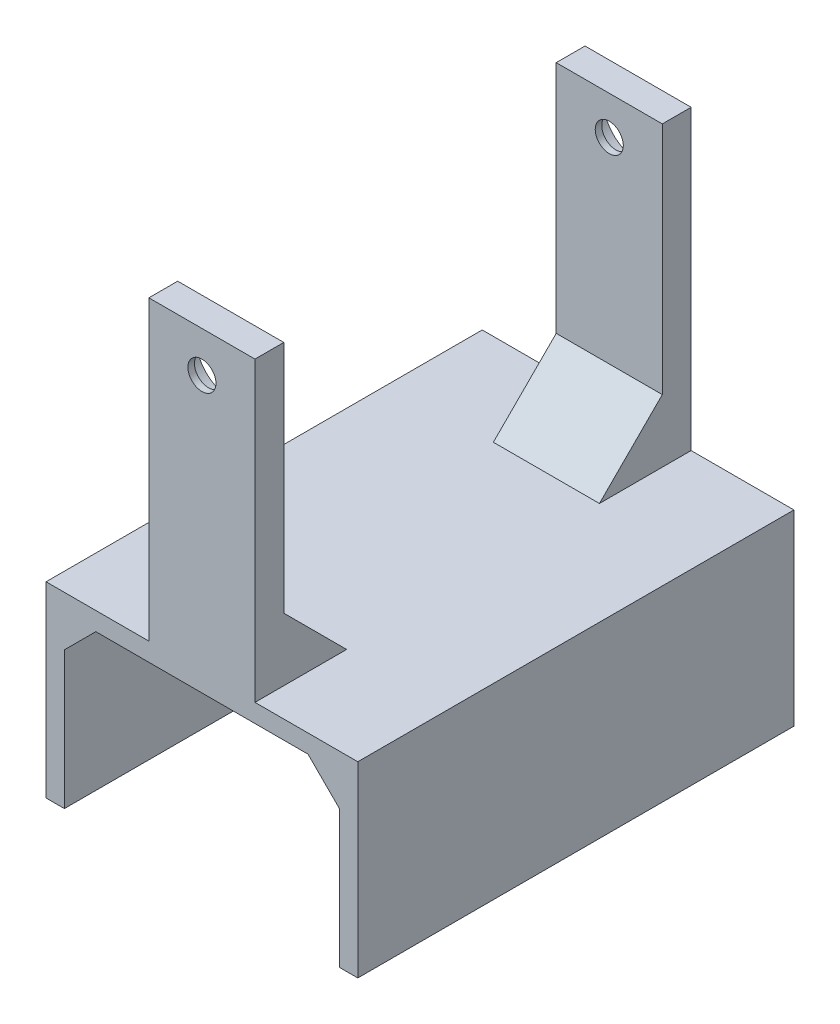
ISO-10303-21;
HEADER;
FILE_DESCRIPTION(('STEP AP214'),'2;1');
FILE_NAME('part.step','',(''),(''),'','','');
FILE_SCHEMA(('AUTOMOTIVE_DESIGN { 1 0 10303 214 1 1 1 1 }'));
ENDSEC;
DATA;
#1=APPLICATION_CONTEXT('core data for automotive mechanical design processes');
#2=APPLICATION_PROTOCOL_DEFINITION('international standard','automotive_design',2000,#1);
#3=PRODUCT_CONTEXT('',#1,'mechanical');
#4=PRODUCT('Part','Part','',(#3));
#5=PRODUCT_RELATED_PRODUCT_CATEGORY('part','',(#4));
#6=PRODUCT_DEFINITION_FORMATION('','',#4);
#7=PRODUCT_DEFINITION_CONTEXT('part definition',#1,'design');
#8=PRODUCT_DEFINITION('design','',#6,#7);
#9=PRODUCT_DEFINITION_SHAPE('','',#8);
#10=(LENGTH_UNIT() NAMED_UNIT(*) SI_UNIT(.MILLI.,.METRE.));
#11=(NAMED_UNIT(*) PLANE_ANGLE_UNIT() SI_UNIT($,.RADIAN.));
#12=(NAMED_UNIT(*) SI_UNIT($,.STERADIAN.) SOLID_ANGLE_UNIT());
#13=UNCERTAINTY_MEASURE_WITH_UNIT(LENGTH_MEASURE(1.E-05),#10,'distance_accuracy_value','');
#14=(GEOMETRIC_REPRESENTATION_CONTEXT(3) GLOBAL_UNCERTAINTY_ASSIGNED_CONTEXT((#13)) GLOBAL_UNIT_ASSIGNED_CONTEXT((#10,
#11,#12)) REPRESENTATION_CONTEXT('',''));
#15=CARTESIAN_POINT('',(0.,0.,0.));
#16=DIRECTION('',(0.,0.,1.));
#17=DIRECTION('',(1.,0.,0.));
#18=AXIS2_PLACEMENT_3D('',#15,#16,#17);
#19=CARTESIAN_POINT('',(0.,112.35,130.62));
#20=DIRECTION('',(0.,0.,1.));
#21=DIRECTION('',(1.,0.,0.));
#22=AXIS2_PLACEMENT_3D('',#19,#20,#21);
#23=CYLINDRICAL_SURFACE('',#22,4.5);
#24=CARTESIAN_POINT('',(0.,112.35,139.86));
#25=DIRECTION('',(0.,0.,1.));
#26=DIRECTION('',(1.,0.,0.));
#27=AXIS2_PLACEMENT_3D('',#24,#25,#26);
#28=CIRCLE('',#27,4.5);
#29=CARTESIAN_POINT('',(4.5,112.35,139.86));
#30=VERTEX_POINT('',#29);
#31=EDGE_CURVE('E238',#30,#30,#28,.T.);
#32=ORIENTED_EDGE('',*,*,#31,.T.);
#33=EDGE_LOOP('',(#32));
#34=FACE_BOUND('',#33,.T.);
#35=CARTESIAN_POINT('',(0.,112.35,137.76));
#36=DIRECTION('',(0.,0.,-1.));
#37=DIRECTION('',(-1.,0.,0.));
#38=AXIS2_PLACEMENT_3D('',#35,#36,#37);
#39=CIRCLE('',#38,4.5);
#40=CARTESIAN_POINT('',(-4.5,112.35,137.76));
#41=VERTEX_POINT('',#40);
#42=EDGE_CURVE('E38',#41,#41,#39,.F.);
#43=ORIENTED_EDGE('',*,*,#42,.F.);
#44=EDGE_LOOP('',(#43));
#45=FACE_BOUND('',#44,.T.);
#46=ADVANCED_FACE('F34',(#34,#45),#23,.F.);
#47=CARTESIAN_POINT('',(0.,30.03,139.86));
#48=DIRECTION('',(0.,-1.,0.));
#49=DIRECTION('',(1.,0.,0.));
#50=AXIS2_PLACEMENT_3D('',#47,#48,#49);
#51=PLANE('',#50);
#52=DIRECTION('',(1.,0.,0.));
#53=VECTOR('',#52,1.);
#54=CARTESIAN_POINT('',(-17.01,30.03,29.4));
#55=LINE('',#54,#53);
#56=CARTESIAN_POINT('',(-17.01,30.03,29.4));
#57=VERTEX_POINT('',#56);
#58=CARTESIAN_POINT('',(17.01,30.03,29.4));
#59=VERTEX_POINT('',#58);
#60=EDGE_CURVE('E195',#57,#59,#55,.T.);
#61=ORIENTED_EDGE('',*,*,#60,.F.);
#62=DIRECTION('',(0.,0.,-1.));
#63=VECTOR('',#62,1.);
#64=CARTESIAN_POINT('',(-17.01,30.03,9.24));
#65=LINE('',#64,#63);
#66=CARTESIAN_POINT('',(-17.01,30.03,0.));
#67=VERTEX_POINT('',#66);
#68=EDGE_CURVE('E51',#57,#67,#65,.T.);
#69=ORIENTED_EDGE('',*,*,#68,.T.);
#70=DIRECTION('',(-1.,0.,0.));
#71=VECTOR('',#70,1.);
#72=CARTESIAN_POINT('',(0.,30.03,0.));
#73=LINE('',#72,#71);
#74=CARTESIAN_POINT('',(-49.98,30.03,0.));
#75=VERTEX_POINT('',#74);
#76=EDGE_CURVE('E322',#67,#75,#73,.T.);
#77=ORIENTED_EDGE('',*,*,#76,.T.);
#78=DIRECTION('',(0.,0.,-1.));
#79=VECTOR('',#78,1.);
#80=CARTESIAN_POINT('',(-49.98,30.03,139.86));
#81=LINE('',#80,#79);
#82=CARTESIAN_POINT('',(-49.98,30.03,139.86));
#83=VERTEX_POINT('',#82);
#84=EDGE_CURVE('E333',#83,#75,#81,.T.);
#85=ORIENTED_EDGE('',*,*,#84,.F.);
#86=DIRECTION('',(-1.,0.,0.));
#87=VECTOR('',#86,1.);
#88=CARTESIAN_POINT('',(0.,30.03,139.86));
#89=LINE('',#88,#87);
#90=CARTESIAN_POINT('',(-17.01,30.03,139.86));
#91=VERTEX_POINT('',#90);
#92=EDGE_CURVE('E303',#91,#83,#89,.T.);
#93=ORIENTED_EDGE('',*,*,#92,.F.);
#94=DIRECTION('',(0.,0.,1.));
#95=VECTOR('',#94,1.);
#96=CARTESIAN_POINT('',(-17.01,30.03,130.62));
#97=LINE('',#96,#95);
#98=CARTESIAN_POINT('',(-17.01,30.03,110.46));
#99=VERTEX_POINT('',#98);
#100=EDGE_CURVE('E253',#99,#91,#97,.T.);
#101=ORIENTED_EDGE('',*,*,#100,.F.);
#102=DIRECTION('',(1.,0.,0.));
#103=VECTOR('',#102,1.);
#104=CARTESIAN_POINT('',(-17.01,30.03,110.46));
#105=LINE('',#104,#103);
#106=CARTESIAN_POINT('',(17.01,30.03,110.46));
#107=VERTEX_POINT('',#106);
#108=EDGE_CURVE('E235',#99,#107,#105,.T.);
#109=ORIENTED_EDGE('',*,*,#108,.T.);
#110=DIRECTION('',(0.,0.,1.));
#111=VECTOR('',#110,1.);
#112=CARTESIAN_POINT('',(17.01,30.03,130.62));
#113=LINE('',#112,#111);
#114=CARTESIAN_POINT('',(17.01,30.03,139.86));
#115=VERTEX_POINT('',#114);
#116=EDGE_CURVE('E266',#107,#115,#113,.T.);
#117=ORIENTED_EDGE('',*,*,#116,.T.);
#118=CARTESIAN_POINT('',(49.98,30.03,139.86));
#119=VERTEX_POINT('',#118);
#120=EDGE_CURVE('E304',#119,#115,#89,.T.);
#121=ORIENTED_EDGE('',*,*,#120,.F.);
#122=DIRECTION('',(0.,0.,-1.));
#123=VECTOR('',#122,1.);
#124=CARTESIAN_POINT('',(49.98,30.03,139.86));
#125=LINE('',#124,#123);
#126=CARTESIAN_POINT('',(49.98,30.03,0.));
#127=VERTEX_POINT('',#126);
#128=EDGE_CURVE('E336',#119,#127,#125,.T.);
#129=ORIENTED_EDGE('',*,*,#128,.T.);
#130=CARTESIAN_POINT('',(17.01,30.03,0.));
#131=VERTEX_POINT('',#130);
#132=EDGE_CURVE('E323',#127,#131,#73,.T.);
#133=ORIENTED_EDGE('',*,*,#132,.T.);
#134=DIRECTION('',(0.,0.,-1.));
#135=VECTOR('',#134,1.);
#136=CARTESIAN_POINT('',(17.01,30.03,9.24));
#137=LINE('',#136,#135);
#138=EDGE_CURVE('E58',#59,#131,#137,.T.);
#139=ORIENTED_EDGE('',*,*,#138,.F.);
#140=EDGE_LOOP('',(#61,#69,#77,#85,#93,#101,#109,#117,#121,#129,#133,#139));
#141=FACE_BOUND('',#140,.T.);
#142=ADVANCED_FACE('F346',(#141),#51,.F.);
#143=CARTESIAN_POINT('',(0.,113.108647765644,9.24));
#144=DIRECTION('',(0.,0.,-1.));
#145=DIRECTION('',(-1.,0.,0.));
#146=AXIS2_PLACEMENT_3D('',#143,#144,#145);
#147=CYLINDRICAL_SURFACE('',#146,4.5);
#148=CARTESIAN_POINT('',(0.,113.108647765644,9.24));
#149=DIRECTION('',(0.,0.,-1.));
#150=DIRECTION('',(-1.,0.,0.));
#151=AXIS2_PLACEMENT_3D('',#148,#149,#150);
#152=CIRCLE('',#151,4.5);
#153=CARTESIAN_POINT('',(-4.5,113.108647765644,9.24));
#154=VERTEX_POINT('',#153);
#155=EDGE_CURVE('E213',#154,#154,#152,.T.);
#156=ORIENTED_EDGE('',*,*,#155,.F.);
#157=EDGE_LOOP('',(#156));
#158=FACE_BOUND('',#157,.T.);
#159=CARTESIAN_POINT('',(0.,113.108647765644,7.14));
#160=DIRECTION('',(0.,0.,-1.));
#161=DIRECTION('',(-1.,0.,0.));
#162=AXIS2_PLACEMENT_3D('',#159,#160,#161);
#163=CIRCLE('',#162,4.5);
#164=CARTESIAN_POINT('',(-4.5,113.108647765644,7.14));
#165=VERTEX_POINT('',#164);
#166=EDGE_CURVE('E210',#165,#165,#163,.F.);
#167=ORIENTED_EDGE('',*,*,#166,.F.);
#168=EDGE_LOOP('',(#167));
#169=FACE_BOUND('',#168,.T.);
#170=ADVANCED_FACE('F344',(#158,#169),#147,.F.);
#171=CARTESIAN_POINT('',(0.,24.15,139.86));
#172=DIRECTION('',(0.,1.,0.));
#173=DIRECTION('',(0.,0.,1.));
#174=AXIS2_PLACEMENT_3D('',#171,#172,#173);
#175=PLANE('',#174);
#176=DIRECTION('',(1.,0.,0.));
#177=VECTOR('',#176,1.);
#178=CARTESIAN_POINT('',(0.,24.15,0.));
#179=LINE('',#178,#177);
#180=CARTESIAN_POINT('',(-34.02,24.15,0.));
#181=VERTEX_POINT('',#180);
#182=CARTESIAN_POINT('',(34.02,24.15,0.));
#183=VERTEX_POINT('',#182);
#184=EDGE_CURVE('E288',#181,#183,#179,.T.);
#185=ORIENTED_EDGE('',*,*,#184,.T.);
#186=DIRECTION('',(0.,0.,1.));
#187=VECTOR('',#186,1.);
#188=CARTESIAN_POINT('',(34.02,24.15,0.));
#189=LINE('',#188,#187);
#190=CARTESIAN_POINT('',(34.02,24.15,139.86));
#191=VERTEX_POINT('',#190);
#192=EDGE_CURVE('E273',#183,#191,#189,.T.);
#193=ORIENTED_EDGE('',*,*,#192,.T.);
#194=DIRECTION('',(1.,0.,0.));
#195=VECTOR('',#194,1.);
#196=CARTESIAN_POINT('',(0.,24.15,139.86));
#197=LINE('',#196,#195);
#198=CARTESIAN_POINT('',(-34.02,24.15,139.86));
#199=VERTEX_POINT('',#198);
#200=EDGE_CURVE('E291',#199,#191,#197,.T.);
#201=ORIENTED_EDGE('',*,*,#200,.F.);
#202=DIRECTION('',(0.,0.,1.));
#203=VECTOR('',#202,1.);
#204=CARTESIAN_POINT('',(-34.02,24.15,0.));
#205=LINE('',#204,#203);
#206=EDGE_CURVE('E286',#181,#199,#205,.T.);
#207=ORIENTED_EDGE('',*,*,#206,.F.);
#208=EDGE_LOOP('',(#185,#193,#201,#207));
#209=FACE_BOUND('',#208,.T.);
#210=ADVANCED_FACE('F36',(#209),#175,.F.);
#211=CARTESIAN_POINT('',(44.1,0.,139.86));
#212=DIRECTION('',(1.,0.,0.));
#213=DIRECTION('',(0.,1.,0.));
#214=AXIS2_PLACEMENT_3D('',#211,#212,#213);
#215=PLANE('',#214);
#216=DIRECTION('',(0.,-1.,0.));
#217=VECTOR('',#216,1.);
#218=CARTESIAN_POINT('',(44.1,0.,139.86));
#219=LINE('',#218,#217);
#220=CARTESIAN_POINT('',(44.1,14.07,139.86));
#221=VERTEX_POINT('',#220);
#222=CARTESIAN_POINT('',(44.1,-30.03,139.86));
#223=VERTEX_POINT('',#222);
#224=EDGE_CURVE('E294',#221,#223,#219,.T.);
#225=ORIENTED_EDGE('',*,*,#224,.F.);
#226=DIRECTION('',(0.,0.,1.));
#227=VECTOR('',#226,1.);
#228=CARTESIAN_POINT('',(44.1,14.07,0.));
#229=LINE('',#228,#227);
#230=CARTESIAN_POINT('',(44.1,14.07,0.));
#231=VERTEX_POINT('',#230);
#232=EDGE_CURVE('E276',#231,#221,#229,.T.);
#233=ORIENTED_EDGE('',*,*,#232,.F.);
#234=DIRECTION('',(0.,-1.,0.));
#235=VECTOR('',#234,1.);
#236=CARTESIAN_POINT('',(44.1,0.,0.));
#237=LINE('',#236,#235);
#238=CARTESIAN_POINT('',(44.1,-30.03,0.));
#239=VERTEX_POINT('',#238);
#240=EDGE_CURVE('E314',#231,#239,#237,.T.);
#241=ORIENTED_EDGE('',*,*,#240,.T.);
#242=DIRECTION('',(0.,0.,-1.));
#243=VECTOR('',#242,1.);
#244=CARTESIAN_POINT('',(44.1,-30.03,139.86));
#245=LINE('',#244,#243);
#246=EDGE_CURVE('E11',#223,#239,#245,.T.);
#247=ORIENTED_EDGE('',*,*,#246,.F.);
#248=EDGE_LOOP('',(#225,#233,#241,#247));
#249=FACE_BOUND('',#248,.T.);
#250=ADVANCED_FACE('F353',(#249),#215,.F.);
#251=CARTESIAN_POINT('',(0.,-30.03,139.86));
#252=DIRECTION('',(0.,-1.,0.));
#253=DIRECTION('',(1.,0.,0.));
#254=AXIS2_PLACEMENT_3D('',#251,#252,#253);
#255=PLANE('',#254);
#256=DIRECTION('',(-1.,0.,0.));
#257=VECTOR('',#256,1.);
#258=CARTESIAN_POINT('',(0.,-30.03,0.));
#259=LINE('',#258,#257);
#260=CARTESIAN_POINT('',(49.98,-30.03,0.));
#261=VERTEX_POINT('',#260);
#262=EDGE_CURVE('E316',#261,#239,#259,.T.);
#263=ORIENTED_EDGE('',*,*,#262,.F.);
#264=DIRECTION('',(0.,0.,-1.));
#265=VECTOR('',#264,1.);
#266=CARTESIAN_POINT('',(49.98,-30.03,139.86));
#267=LINE('',#266,#265);
#268=CARTESIAN_POINT('',(49.98,-30.03,139.86));
#269=VERTEX_POINT('',#268);
#270=EDGE_CURVE('E43',#269,#261,#267,.T.);
#271=ORIENTED_EDGE('',*,*,#270,.F.);
#272=DIRECTION('',(-1.,0.,0.));
#273=VECTOR('',#272,1.);
#274=CARTESIAN_POINT('',(0.,-30.03,139.86));
#275=LINE('',#274,#273);
#276=EDGE_CURVE('E297',#269,#223,#275,.T.);
#277=ORIENTED_EDGE('',*,*,#276,.T.);
#278=ORIENTED_EDGE('',*,*,#246,.T.);
#279=EDGE_LOOP('',(#263,#271,#277,#278));
#280=FACE_BOUND('',#279,.T.);
#281=ADVANCED_FACE('F410',(#280),#255,.T.);
#282=CARTESIAN_POINT('',(49.98,0.,139.86));
#283=DIRECTION('',(-1.,0.,0.));
#284=DIRECTION('',(0.,0.,1.));
#285=AXIS2_PLACEMENT_3D('',#282,#283,#284);
#286=PLANE('',#285);
#287=DIRECTION('',(0.,1.,0.));
#288=VECTOR('',#287,1.);
#289=CARTESIAN_POINT('',(49.98,0.,0.));
#290=LINE('',#289,#288);
#291=EDGE_CURVE('E319',#261,#127,#290,.T.);
#292=ORIENTED_EDGE('',*,*,#291,.T.);
#293=ORIENTED_EDGE('',*,*,#128,.F.);
#294=DIRECTION('',(0.,1.,0.));
#295=VECTOR('',#294,1.);
#296=CARTESIAN_POINT('',(49.98,0.,139.86));
#297=LINE('',#296,#295);
#298=EDGE_CURVE('E300',#269,#119,#297,.T.);
#299=ORIENTED_EDGE('',*,*,#298,.F.);
#300=ORIENTED_EDGE('',*,*,#270,.T.);
#301=EDGE_LOOP('',(#292,#293,#299,#300));
#302=FACE_BOUND('',#301,.T.);
#303=ADVANCED_FACE('F412',(#302),#286,.F.);
#304=CARTESIAN_POINT('',(-49.98,0.,139.86));
#305=DIRECTION('',(-1.,0.,0.));
#306=DIRECTION('',(0.,0.,1.));
#307=AXIS2_PLACEMENT_3D('',#304,#305,#306);
#308=PLANE('',#307);
#309=DIRECTION('',(0.,1.,0.));
#310=VECTOR('',#309,1.);
#311=CARTESIAN_POINT('',(-49.98,0.,0.));
#312=LINE('',#311,#310);
#313=CARTESIAN_POINT('',(-49.98,-30.03,0.));
#314=VERTEX_POINT('',#313);
#315=EDGE_CURVE('E325',#314,#75,#312,.T.);
#316=ORIENTED_EDGE('',*,*,#315,.F.);
#317=DIRECTION('',(0.,0.,-1.));
#318=VECTOR('',#317,1.);
#319=CARTESIAN_POINT('',(-49.98,-30.03,139.86));
#320=LINE('',#319,#318);
#321=CARTESIAN_POINT('',(-49.98,-30.03,139.86));
#322=VERTEX_POINT('',#321);
#323=EDGE_CURVE('E331',#322,#314,#320,.T.);
#324=ORIENTED_EDGE('',*,*,#323,.F.);
#325=DIRECTION('',(0.,1.,0.));
#326=VECTOR('',#325,1.);
#327=CARTESIAN_POINT('',(-49.98,0.,139.86));
#328=LINE('',#327,#326);
#329=EDGE_CURVE('E307',#322,#83,#328,.T.);
#330=ORIENTED_EDGE('',*,*,#329,.T.);
#331=ORIENTED_EDGE('',*,*,#84,.T.);
#332=EDGE_LOOP('',(#316,#324,#330,#331));
#333=FACE_BOUND('',#332,.T.);
#334=ADVANCED_FACE('F408',(#333),#308,.T.);
#335=CARTESIAN_POINT('',(-44.1,-30.03,0.));
#336=VERTEX_POINT('',#335);
#337=EDGE_CURVE('E320',#336,#314,#259,.T.);
#338=ORIENTED_EDGE('',*,*,#337,.F.);
#339=DIRECTION('',(0.,0.,-1.));
#340=VECTOR('',#339,1.);
#341=CARTESIAN_POINT('',(-44.1,-30.03,139.86));
#342=LINE('',#341,#340);
#343=CARTESIAN_POINT('',(-44.1,-30.03,139.86));
#344=VERTEX_POINT('',#343);
#345=EDGE_CURVE('E312',#344,#336,#342,.T.);
#346=ORIENTED_EDGE('',*,*,#345,.F.);
#347=EDGE_CURVE('E301',#344,#322,#275,.T.);
#348=ORIENTED_EDGE('',*,*,#347,.T.);
#349=ORIENTED_EDGE('',*,*,#323,.T.);
#350=EDGE_LOOP('',(#338,#346,#348,#349));
#351=FACE_BOUND('',#350,.T.);
#352=ADVANCED_FACE('F404',(#351),#255,.T.);
#353=CARTESIAN_POINT('',(-44.1,0.,139.86));
#354=DIRECTION('',(1.,0.,0.));
#355=DIRECTION('',(0.,1.,0.));
#356=AXIS2_PLACEMENT_3D('',#353,#354,#355);
#357=PLANE('',#356);
#358=DIRECTION('',(0.,0.,1.));
#359=VECTOR('',#358,1.);
#360=CARTESIAN_POINT('',(-44.1,14.07,0.));
#361=LINE('',#360,#359);
#362=CARTESIAN_POINT('',(-44.1,14.07,0.));
#363=VERTEX_POINT('',#362);
#364=CARTESIAN_POINT('',(-44.1,14.07,139.86));
#365=VERTEX_POINT('',#364);
#366=EDGE_CURVE('E283',#363,#365,#361,.T.);
#367=ORIENTED_EDGE('',*,*,#366,.T.);
#368=DIRECTION('',(0.,-1.,0.));
#369=VECTOR('',#368,1.);
#370=CARTESIAN_POINT('',(-44.1,0.,139.86));
#371=LINE('',#370,#369);
#372=EDGE_CURVE('E310',#365,#344,#371,.T.);
#373=ORIENTED_EDGE('',*,*,#372,.T.);
#374=ORIENTED_EDGE('',*,*,#345,.T.);
#375=DIRECTION('',(0.,-1.,0.));
#376=VECTOR('',#375,1.);
#377=CARTESIAN_POINT('',(-44.1,0.,0.));
#378=LINE('',#377,#376);
#379=EDGE_CURVE('E295',#363,#336,#378,.T.);
#380=ORIENTED_EDGE('',*,*,#379,.F.);
#381=EDGE_LOOP('',(#367,#373,#374,#380));
#382=FACE_BOUND('',#381,.T.);
#383=ADVANCED_FACE('F397',(#382),#357,.T.);
#384=CARTESIAN_POINT('',(0.,0.,139.86));
#385=DIRECTION('',(0.,0.,1.));
#386=DIRECTION('',(1.,0.,0.));
#387=AXIS2_PLACEMENT_3D('',#384,#385,#386);
#388=PLANE('',#387);
#389=ORIENTED_EDGE('',*,*,#31,.F.);
#390=EDGE_LOOP('',(#389));
#391=FACE_BOUND('',#390,.T.);
#392=ORIENTED_EDGE('',*,*,#200,.T.);
#393=DIRECTION('',(0.707106781186547,-0.707106781186548,0.));
#394=VECTOR('',#393,1.);
#395=CARTESIAN_POINT('',(44.1,14.07,139.86));
#396=LINE('',#395,#394);
#397=EDGE_CURVE('E263',#191,#221,#396,.T.);
#398=ORIENTED_EDGE('',*,*,#397,.T.);
#399=ORIENTED_EDGE('',*,*,#224,.T.);
#400=ORIENTED_EDGE('',*,*,#276,.F.);
#401=ORIENTED_EDGE('',*,*,#298,.T.);
#402=ORIENTED_EDGE('',*,*,#120,.T.);
#403=DIRECTION('',(0.,1.,0.));
#404=VECTOR('',#403,1.);
#405=CARTESIAN_POINT('',(17.01,125.37,139.86));
#406=LINE('',#405,#404);
#407=CARTESIAN_POINT('',(17.01,125.37,139.86));
#408=VERTEX_POINT('',#407);
#409=EDGE_CURVE('E256',#115,#408,#406,.T.);
#410=ORIENTED_EDGE('',*,*,#409,.T.);
#411=DIRECTION('',(-1.,0.,0.));
#412=VECTOR('',#411,1.);
#413=CARTESIAN_POINT('',(17.01,125.37,139.86));
#414=LINE('',#413,#412);
#415=CARTESIAN_POINT('',(-17.01,125.37,139.86));
#416=VERTEX_POINT('',#415);
#417=EDGE_CURVE('E248',#408,#416,#414,.T.);
#418=ORIENTED_EDGE('',*,*,#417,.T.);
#419=DIRECTION('',(0.,-1.,0.));
#420=VECTOR('',#419,1.);
#421=CARTESIAN_POINT('',(-17.01,125.37,139.86));
#422=LINE('',#421,#420);
#423=EDGE_CURVE('E243',#416,#91,#422,.T.);
#424=ORIENTED_EDGE('',*,*,#423,.T.);
#425=ORIENTED_EDGE('',*,*,#92,.T.);
#426=ORIENTED_EDGE('',*,*,#329,.F.);
#427=ORIENTED_EDGE('',*,*,#347,.F.);
#428=ORIENTED_EDGE('',*,*,#372,.F.);
#429=DIRECTION('',(0.707106781186547,0.707106781186548,0.));
#430=VECTOR('',#429,1.);
#431=CARTESIAN_POINT('',(-44.1,14.07,139.86));
#432=LINE('',#431,#430);
#433=EDGE_CURVE('E279',#365,#199,#432,.T.);
#434=ORIENTED_EDGE('',*,*,#433,.T.);
#435=EDGE_LOOP('',(#392,#398,#399,#400,#401,#402,#410,#418,#424,#425,#426,#427,#428,#434));
#436=FACE_BOUND('',#435,.T.);
#437=ADVANCED_FACE('F394',(#391,#436),#388,.T.);
#438=CARTESIAN_POINT('',(0.,0.,0.));
#439=DIRECTION('',(0.,0.,1.));
#440=DIRECTION('',(1.,0.,0.));
#441=AXIS2_PLACEMENT_3D('',#438,#439,#440);
#442=PLANE('',#441);
#443=CARTESIAN_POINT('',(0.,113.108647765644,0.));
#444=DIRECTION('',(0.,0.,-1.));
#445=DIRECTION('',(-1.,0.,0.));
#446=AXIS2_PLACEMENT_3D('',#443,#444,#445);
#447=CIRCLE('',#446,11.13);
#448=CARTESIAN_POINT('',(-11.13,113.108647765644,0.));
#449=VERTEX_POINT('',#448);
#450=EDGE_CURVE('E205',#449,#449,#447,.T.);
#451=ORIENTED_EDGE('',*,*,#450,.F.);
#452=EDGE_LOOP('',(#451));
#453=FACE_BOUND('',#452,.T.);
#454=DIRECTION('',(0.707106781186547,-0.707106781186548,0.));
#455=VECTOR('',#454,1.);
#456=CARTESIAN_POINT('',(44.1,14.07,0.));
#457=LINE('',#456,#455);
#458=EDGE_CURVE('E270',#183,#231,#457,.T.);
#459=ORIENTED_EDGE('',*,*,#458,.F.);
#460=ORIENTED_EDGE('',*,*,#184,.F.);
#461=DIRECTION('',(0.707106781186547,0.707106781186548,0.));
#462=VECTOR('',#461,1.);
#463=CARTESIAN_POINT('',(-44.1,14.07,0.));
#464=LINE('',#463,#462);
#465=EDGE_CURVE('E281',#363,#181,#464,.T.);
#466=ORIENTED_EDGE('',*,*,#465,.F.);
#467=ORIENTED_EDGE('',*,*,#379,.T.);
#468=ORIENTED_EDGE('',*,*,#337,.T.);
#469=ORIENTED_EDGE('',*,*,#315,.T.);
#470=ORIENTED_EDGE('',*,*,#76,.F.);
#471=DIRECTION('',(0.,1.,0.));
#472=VECTOR('',#471,1.);
#473=CARTESIAN_POINT('',(-17.01,30.03,0.));
#474=LINE('',#473,#472);
#475=CARTESIAN_POINT('',(-17.01,125.37,0.));
#476=VERTEX_POINT('',#475);
#477=EDGE_CURVE('E186',#67,#476,#474,.T.);
#478=ORIENTED_EDGE('',*,*,#477,.T.);
#479=DIRECTION('',(1.,0.,0.));
#480=VECTOR('',#479,1.);
#481=CARTESIAN_POINT('',(-17.01,125.37,0.));
#482=LINE('',#481,#480);
#483=CARTESIAN_POINT('',(17.01,125.37,0.));
#484=VERTEX_POINT('',#483);
#485=EDGE_CURVE('E220',#476,#484,#482,.T.);
#486=ORIENTED_EDGE('',*,*,#485,.T.);
#487=DIRECTION('',(0.,1.,0.));
#488=VECTOR('',#487,1.);
#489=CARTESIAN_POINT('',(17.01,30.03,0.));
#490=LINE('',#489,#488);
#491=EDGE_CURVE('E215',#131,#484,#490,.T.);
#492=ORIENTED_EDGE('',*,*,#491,.F.);
#493=ORIENTED_EDGE('',*,*,#132,.F.);
#494=ORIENTED_EDGE('',*,*,#291,.F.);
#495=ORIENTED_EDGE('',*,*,#262,.T.);
#496=ORIENTED_EDGE('',*,*,#240,.F.);
#497=EDGE_LOOP('',(#459,#460,#466,#467,#468,#469,#470,#478,#486,#492,#493,#494,#495,#496));
#498=FACE_BOUND('',#497,.T.);
#499=ADVANCED_FACE('F392',(#453,#498),#442,.F.);
#500=CARTESIAN_POINT('',(-44.1,14.07,0.));
#501=DIRECTION('',(0.707106781186548,-0.707106781186547,0.));
#502=DIRECTION('',(0.707106781186547,0.707106781186548,0.));
#503=AXIS2_PLACEMENT_3D('',#500,#501,#502);
#504=PLANE('',#503);
#505=ORIENTED_EDGE('',*,*,#433,.F.);
#506=ORIENTED_EDGE('',*,*,#366,.F.);
#507=ORIENTED_EDGE('',*,*,#465,.T.);
#508=ORIENTED_EDGE('',*,*,#206,.T.);
#509=EDGE_LOOP('',(#505,#506,#507,#508));
#510=FACE_BOUND('',#509,.T.);
#511=ADVANCED_FACE('F388',(#510),#504,.T.);
#512=CARTESIAN_POINT('',(44.1,14.07,0.));
#513=DIRECTION('',(-0.707106781186548,-0.707106781186547,0.));
#514=DIRECTION('',(0.707106781186547,-0.707106781186548,0.));
#515=AXIS2_PLACEMENT_3D('',#512,#513,#514);
#516=PLANE('',#515);
#517=ORIENTED_EDGE('',*,*,#397,.F.);
#518=ORIENTED_EDGE('',*,*,#192,.F.);
#519=ORIENTED_EDGE('',*,*,#458,.T.);
#520=ORIENTED_EDGE('',*,*,#232,.T.);
#521=EDGE_LOOP('',(#517,#518,#519,#520));
#522=FACE_BOUND('',#521,.T.);
#523=ADVANCED_FACE('F384',(#522),#516,.T.);
#524=CARTESIAN_POINT('',(-17.01,125.37,130.62));
#525=DIRECTION('',(-1.,0.,0.));
#526=DIRECTION('',(0.,0.,1.));
#527=AXIS2_PLACEMENT_3D('',#524,#525,#526);
#528=PLANE('',#527);
#529=ORIENTED_EDGE('',*,*,#423,.F.);
#530=DIRECTION('',(0.,0.,1.));
#531=VECTOR('',#530,1.);
#532=CARTESIAN_POINT('',(-17.01,125.37,130.62));
#533=LINE('',#532,#531);
#534=CARTESIAN_POINT('',(-17.01,125.37,130.62));
#535=VERTEX_POINT('',#534);
#536=EDGE_CURVE('E261',#535,#416,#533,.T.);
#537=ORIENTED_EDGE('',*,*,#536,.F.);
#538=DIRECTION('',(0.,-1.,0.));
#539=VECTOR('',#538,1.);
#540=CARTESIAN_POINT('',(-17.01,125.37,130.62));
#541=LINE('',#540,#539);
#542=CARTESIAN_POINT('',(-17.01,50.19,130.62));
#543=VERTEX_POINT('',#542);
#544=EDGE_CURVE('E244',#535,#543,#541,.T.);
#545=ORIENTED_EDGE('',*,*,#544,.T.);
#546=DIRECTION('',(0.,0.707106781186548,0.707106781186547));
#547=VECTOR('',#546,1.);
#548=CARTESIAN_POINT('',(-17.01,30.03,110.46));
#549=LINE('',#548,#547);
#550=EDGE_CURVE('E231',#99,#543,#549,.T.);
#551=ORIENTED_EDGE('',*,*,#550,.F.);
#552=ORIENTED_EDGE('',*,*,#100,.T.);
#553=EDGE_LOOP('',(#529,#537,#545,#551,#552));
#554=FACE_BOUND('',#553,.T.);
#555=ADVANCED_FACE('F377',(#554),#528,.T.);
#556=CARTESIAN_POINT('',(17.01,125.37,130.62));
#557=DIRECTION('',(0.,1.,0.));
#558=DIRECTION('',(0.,0.,1.));
#559=AXIS2_PLACEMENT_3D('',#556,#557,#558);
#560=PLANE('',#559);
#561=ORIENTED_EDGE('',*,*,#417,.F.);
#562=DIRECTION('',(0.,0.,1.));
#563=VECTOR('',#562,1.);
#564=CARTESIAN_POINT('',(17.01,125.37,130.62));
#565=LINE('',#564,#563);
#566=CARTESIAN_POINT('',(17.01,125.37,130.62));
#567=VERTEX_POINT('',#566);
#568=EDGE_CURVE('E264',#567,#408,#565,.T.);
#569=ORIENTED_EDGE('',*,*,#568,.F.);
#570=DIRECTION('',(-1.,0.,0.));
#571=VECTOR('',#570,1.);
#572=CARTESIAN_POINT('',(17.01,125.37,130.62));
#573=LINE('',#572,#571);
#574=EDGE_CURVE('E250',#567,#535,#573,.T.);
#575=ORIENTED_EDGE('',*,*,#574,.T.);
#576=ORIENTED_EDGE('',*,*,#536,.T.);
#577=EDGE_LOOP('',(#561,#569,#575,#576));
#578=FACE_BOUND('',#577,.T.);
#579=ADVANCED_FACE('F374',(#578),#560,.T.);
#580=CARTESIAN_POINT('',(17.01,125.37,130.62));
#581=DIRECTION('',(1.,0.,0.));
#582=DIRECTION('',(0.,0.,-1.));
#583=AXIS2_PLACEMENT_3D('',#580,#581,#582);
#584=PLANE('',#583);
#585=ORIENTED_EDGE('',*,*,#409,.F.);
#586=ORIENTED_EDGE('',*,*,#116,.F.);
#587=DIRECTION('',(0.,0.707106781186548,0.707106781186547));
#588=VECTOR('',#587,1.);
#589=CARTESIAN_POINT('',(17.01,30.03,110.46));
#590=LINE('',#589,#588);
#591=CARTESIAN_POINT('',(17.01,50.19,130.62));
#592=VERTEX_POINT('',#591);
#593=EDGE_CURVE('E230',#107,#592,#590,.T.);
#594=ORIENTED_EDGE('',*,*,#593,.T.);
#595=DIRECTION('',(0.,1.,0.));
#596=VECTOR('',#595,1.);
#597=CARTESIAN_POINT('',(17.01,125.37,130.62));
#598=LINE('',#597,#596);
#599=EDGE_CURVE('E247',#592,#567,#598,.T.);
#600=ORIENTED_EDGE('',*,*,#599,.T.);
#601=ORIENTED_EDGE('',*,*,#568,.T.);
#602=EDGE_LOOP('',(#585,#586,#594,#600,#601));
#603=FACE_BOUND('',#602,.T.);
#604=ADVANCED_FACE('F372',(#603),#584,.T.);
#605=CARTESIAN_POINT('',(0.,0.,130.62));
#606=DIRECTION('',(0.,0.,-1.));
#607=DIRECTION('',(-1.,0.,0.));
#608=AXIS2_PLACEMENT_3D('',#605,#606,#607);
#609=PLANE('',#608);
#610=CARTESIAN_POINT('',(0.,112.35,130.62));
#611=DIRECTION('',(0.,0.,-1.));
#612=DIRECTION('',(-1.,0.,0.));
#613=AXIS2_PLACEMENT_3D('',#610,#611,#612);
#614=CIRCLE('',#613,11.13);
#615=CARTESIAN_POINT('',(-11.13,112.35,130.62));
#616=VERTEX_POINT('',#615);
#617=EDGE_CURVE('E504',#616,#616,#614,.T.);
#618=ORIENTED_EDGE('',*,*,#617,.F.);
#619=EDGE_LOOP('',(#618));
#620=FACE_BOUND('',#619,.T.);
#621=DIRECTION('',(1.,0.,0.));
#622=VECTOR('',#621,1.);
#623=CARTESIAN_POINT('',(-17.01,50.19,130.62));
#624=LINE('',#623,#622);
#625=EDGE_CURVE('E233',#543,#592,#624,.T.);
#626=ORIENTED_EDGE('',*,*,#625,.F.);
#627=ORIENTED_EDGE('',*,*,#544,.F.);
#628=ORIENTED_EDGE('',*,*,#574,.F.);
#629=ORIENTED_EDGE('',*,*,#599,.F.);
#630=EDGE_LOOP('',(#626,#627,#628,#629));
#631=FACE_BOUND('',#630,.T.);
#632=ADVANCED_FACE('F369',(#620,#631),#609,.T.);
#633=CARTESIAN_POINT('',(-17.01,30.03,110.46));
#634=DIRECTION('',(0.,0.707106781186547,-0.707106781186548));
#635=DIRECTION('',(0.,0.707106781186548,0.707106781186547));
#636=AXIS2_PLACEMENT_3D('',#633,#634,#635);
#637=PLANE('',#636);
#638=ORIENTED_EDGE('',*,*,#593,.F.);
#639=ORIENTED_EDGE('',*,*,#108,.F.);
#640=ORIENTED_EDGE('',*,*,#550,.T.);
#641=ORIENTED_EDGE('',*,*,#625,.T.);
#642=EDGE_LOOP('',(#638,#639,#640,#641));
#643=FACE_BOUND('',#642,.T.);
#644=ADVANCED_FACE('F367',(#643),#637,.T.);
#645=CARTESIAN_POINT('',(17.01,30.03,9.24));
#646=DIRECTION('',(-1.,0.,0.));
#647=DIRECTION('',(0.,0.,1.));
#648=AXIS2_PLACEMENT_3D('',#645,#646,#647);
#649=PLANE('',#648);
#650=ORIENTED_EDGE('',*,*,#491,.T.);
#651=DIRECTION('',(0.,0.,-1.));
#652=VECTOR('',#651,1.);
#653=CARTESIAN_POINT('',(17.01,125.37,9.24));
#654=LINE('',#653,#652);
#655=CARTESIAN_POINT('',(17.01,125.37,9.24));
#656=VERTEX_POINT('',#655);
#657=EDGE_CURVE('E181',#656,#484,#654,.T.);
#658=ORIENTED_EDGE('',*,*,#657,.F.);
#659=DIRECTION('',(0.,1.,0.));
#660=VECTOR('',#659,1.);
#661=CARTESIAN_POINT('',(17.01,30.03,9.24));
#662=LINE('',#661,#660);
#663=CARTESIAN_POINT('',(17.01,50.19,9.24));
#664=VERTEX_POINT('',#663);
#665=EDGE_CURVE('E175',#664,#656,#662,.T.);
#666=ORIENTED_EDGE('',*,*,#665,.F.);
#667=DIRECTION('',(0.,-0.707106781186548,0.707106781186548));
#668=VECTOR('',#667,1.);
#669=CARTESIAN_POINT('',(17.01,50.19,9.24));
#670=LINE('',#669,#668);
#671=EDGE_CURVE('E180',#664,#59,#670,.T.);
#672=ORIENTED_EDGE('',*,*,#671,.T.);
#673=ORIENTED_EDGE('',*,*,#138,.T.);
#674=EDGE_LOOP('',(#650,#658,#666,#672,#673));
#675=FACE_BOUND('',#674,.T.);
#676=ADVANCED_FACE('F178',(#675),#649,.F.);
#677=CARTESIAN_POINT('',(-17.01,125.37,9.24));
#678=DIRECTION('',(0.,1.,0.));
#679=DIRECTION('',(0.,0.,1.));
#680=AXIS2_PLACEMENT_3D('',#677,#678,#679);
#681=PLANE('',#680);
#682=ORIENTED_EDGE('',*,*,#485,.F.);
#683=DIRECTION('',(0.,0.,-1.));
#684=VECTOR('',#683,1.);
#685=CARTESIAN_POINT('',(-17.01,125.37,9.24));
#686=LINE('',#685,#684);
#687=CARTESIAN_POINT('',(-17.01,125.37,9.24));
#688=VERTEX_POINT('',#687);
#689=EDGE_CURVE('E226',#688,#476,#686,.T.);
#690=ORIENTED_EDGE('',*,*,#689,.F.);
#691=DIRECTION('',(1.,0.,0.));
#692=VECTOR('',#691,1.);
#693=CARTESIAN_POINT('',(-17.01,125.37,9.24));
#694=LINE('',#693,#692);
#695=EDGE_CURVE('E185',#688,#656,#694,.T.);
#696=ORIENTED_EDGE('',*,*,#695,.T.);
#697=ORIENTED_EDGE('',*,*,#657,.T.);
#698=EDGE_LOOP('',(#682,#690,#696,#697));
#699=FACE_BOUND('',#698,.T.);
#700=ADVANCED_FACE('F468',(#699),#681,.T.);
#701=CARTESIAN_POINT('',(-17.01,30.03,9.24));
#702=DIRECTION('',(-1.,0.,0.));
#703=DIRECTION('',(0.,0.,1.));
#704=AXIS2_PLACEMENT_3D('',#701,#702,#703);
#705=PLANE('',#704);
#706=ORIENTED_EDGE('',*,*,#477,.F.);
#707=ORIENTED_EDGE('',*,*,#68,.F.);
#708=DIRECTION('',(0.,-0.707106781186548,0.707106781186548));
#709=VECTOR('',#708,1.);
#710=CARTESIAN_POINT('',(-17.01,50.19,9.24));
#711=LINE('',#710,#709);
#712=CARTESIAN_POINT('',(-17.01,50.19,9.24));
#713=VERTEX_POINT('',#712);
#714=EDGE_CURVE('E196',#713,#57,#711,.T.);
#715=ORIENTED_EDGE('',*,*,#714,.F.);
#716=DIRECTION('',(0.,1.,0.));
#717=VECTOR('',#716,1.);
#718=CARTESIAN_POINT('',(-17.01,30.03,9.24));
#719=LINE('',#718,#717);
#720=EDGE_CURVE('E192',#713,#688,#719,.T.);
#721=ORIENTED_EDGE('',*,*,#720,.T.);
#722=ORIENTED_EDGE('',*,*,#689,.T.);
#723=EDGE_LOOP('',(#706,#707,#715,#721,#722));
#724=FACE_BOUND('',#723,.T.);
#725=ADVANCED_FACE('F464',(#724),#705,.T.);
#726=CARTESIAN_POINT('',(0.,0.,9.24));
#727=DIRECTION('',(0.,0.,1.));
#728=DIRECTION('',(1.,0.,0.));
#729=AXIS2_PLACEMENT_3D('',#726,#727,#728);
#730=PLANE('',#729);
#731=DIRECTION('',(1.,0.,0.));
#732=VECTOR('',#731,1.);
#733=CARTESIAN_POINT('',(-17.01,50.19,9.24));
#734=LINE('',#733,#732);
#735=EDGE_CURVE('E189',#713,#664,#734,.T.);
#736=ORIENTED_EDGE('',*,*,#735,.T.);
#737=ORIENTED_EDGE('',*,*,#665,.T.);
#738=ORIENTED_EDGE('',*,*,#695,.F.);
#739=ORIENTED_EDGE('',*,*,#720,.F.);
#740=EDGE_LOOP('',(#736,#737,#738,#739));
#741=FACE_BOUND('',#740,.T.);
#742=ORIENTED_EDGE('',*,*,#155,.T.);
#743=EDGE_LOOP('',(#742));
#744=FACE_BOUND('',#743,.T.);
#745=ADVANCED_FACE('F190',(#741,#744),#730,.T.);
#746=CARTESIAN_POINT('',(0.,113.108647765644,7.14));
#747=DIRECTION('',(0.,0.,-1.));
#748=DIRECTION('',(-1.,0.,0.));
#749=AXIS2_PLACEMENT_3D('',#746,#747,#748);
#750=PLANE('',#749);
#751=CARTESIAN_POINT('',(0.,113.108647765644,7.14));
#752=DIRECTION('',(0.,0.,-1.));
#753=DIRECTION('',(-1.,0.,0.));
#754=AXIS2_PLACEMENT_3D('',#751,#752,#753);
#755=CIRCLE('',#754,11.13);
#756=CARTESIAN_POINT('',(-11.13,113.108647765644,7.14));
#757=VERTEX_POINT('',#756);
#758=EDGE_CURVE('E207',#757,#757,#755,.T.);
#759=ORIENTED_EDGE('',*,*,#758,.T.);
#760=EDGE_LOOP('',(#759));
#761=FACE_BOUND('',#760,.T.);
#762=ORIENTED_EDGE('',*,*,#166,.T.);
#763=EDGE_LOOP('',(#762));
#764=FACE_BOUND('',#763,.T.);
#765=ADVANCED_FACE('F342',(#761,#764),#750,.T.);
#766=CARTESIAN_POINT('',(0.,113.108647765644,7.14));
#767=DIRECTION('',(0.,0.,-1.));
#768=DIRECTION('',(-1.,0.,0.));
#769=AXIS2_PLACEMENT_3D('',#766,#767,#768);
#770=CYLINDRICAL_SURFACE('',#769,11.13);
#771=ORIENTED_EDGE('',*,*,#758,.F.);
#772=EDGE_LOOP('',(#771));
#773=FACE_BOUND('',#772,.T.);
#774=ORIENTED_EDGE('',*,*,#450,.T.);
#775=EDGE_LOOP('',(#774));
#776=FACE_BOUND('',#775,.T.);
#777=ADVANCED_FACE('F481',(#773,#776),#770,.F.);
#778=CARTESIAN_POINT('',(-17.01,50.19,9.24));
#779=DIRECTION('',(0.,0.707106781186547,0.707106781186547));
#780=DIRECTION('',(0.,-0.707106781186548,0.707106781186548));
#781=AXIS2_PLACEMENT_3D('',#778,#779,#780);
#782=PLANE('',#781);
#783=ORIENTED_EDGE('',*,*,#671,.F.);
#784=ORIENTED_EDGE('',*,*,#735,.F.);
#785=ORIENTED_EDGE('',*,*,#714,.T.);
#786=ORIENTED_EDGE('',*,*,#60,.T.);
#787=EDGE_LOOP('',(#783,#784,#785,#786));
#788=FACE_BOUND('',#787,.T.);
#789=ADVANCED_FACE('F198',(#788),#782,.T.);
#790=CARTESIAN_POINT('',(0.,112.35,137.76));
#791=DIRECTION('',(0.,0.,-1.));
#792=DIRECTION('',(-1.,0.,0.));
#793=AXIS2_PLACEMENT_3D('',#790,#791,#792);
#794=PLANE('',#793);
#795=CARTESIAN_POINT('',(0.,112.35,137.76));
#796=DIRECTION('',(0.,0.,-1.));
#797=DIRECTION('',(-1.,0.,0.));
#798=AXIS2_PLACEMENT_3D('',#795,#796,#797);
#799=CIRCLE('',#798,11.13);
#800=CARTESIAN_POINT('',(-11.13,112.35,137.76));
#801=VERTEX_POINT('',#800);
#802=EDGE_CURVE('E202',#801,#801,#799,.T.);
#803=ORIENTED_EDGE('',*,*,#802,.T.);
#804=EDGE_LOOP('',(#803));
#805=FACE_BOUND('',#804,.T.);
#806=ORIENTED_EDGE('',*,*,#42,.T.);
#807=EDGE_LOOP('',(#806));
#808=FACE_BOUND('',#807,.T.);
#809=ADVANCED_FACE('F491',(#805,#808),#794,.T.);
#810=CARTESIAN_POINT('',(0.,112.35,137.76));
#811=DIRECTION('',(0.,0.,-1.));
#812=DIRECTION('',(-1.,0.,0.));
#813=AXIS2_PLACEMENT_3D('',#810,#811,#812);
#814=CYLINDRICAL_SURFACE('',#813,11.13);
#815=ORIENTED_EDGE('',*,*,#802,.F.);
#816=EDGE_LOOP('',(#815));
#817=FACE_BOUND('',#816,.T.);
#818=ORIENTED_EDGE('',*,*,#617,.T.);
#819=EDGE_LOOP('',(#818));
#820=FACE_BOUND('',#819,.T.);
#821=ADVANCED_FACE('F492',(#817,#820),#814,.F.);
#822=CLOSED_SHELL('',(#46,#142,#170,#210,#250,#281,#303,#334,#352,#383,#437,#499,#511,#523,#555,
#579,#604,#632,#644,#676,#700,#725,#745,#765,#777,#789,#809,#821));
#823=MANIFOLD_SOLID_BREP('B2',#822);
#824=ADVANCED_BREP_SHAPE_REPRESENTATION('',(#18,#823),#14);
#825=SHAPE_DEFINITION_REPRESENTATION(#9,#824);
ENDSEC;
END-ISO-10303-21;
